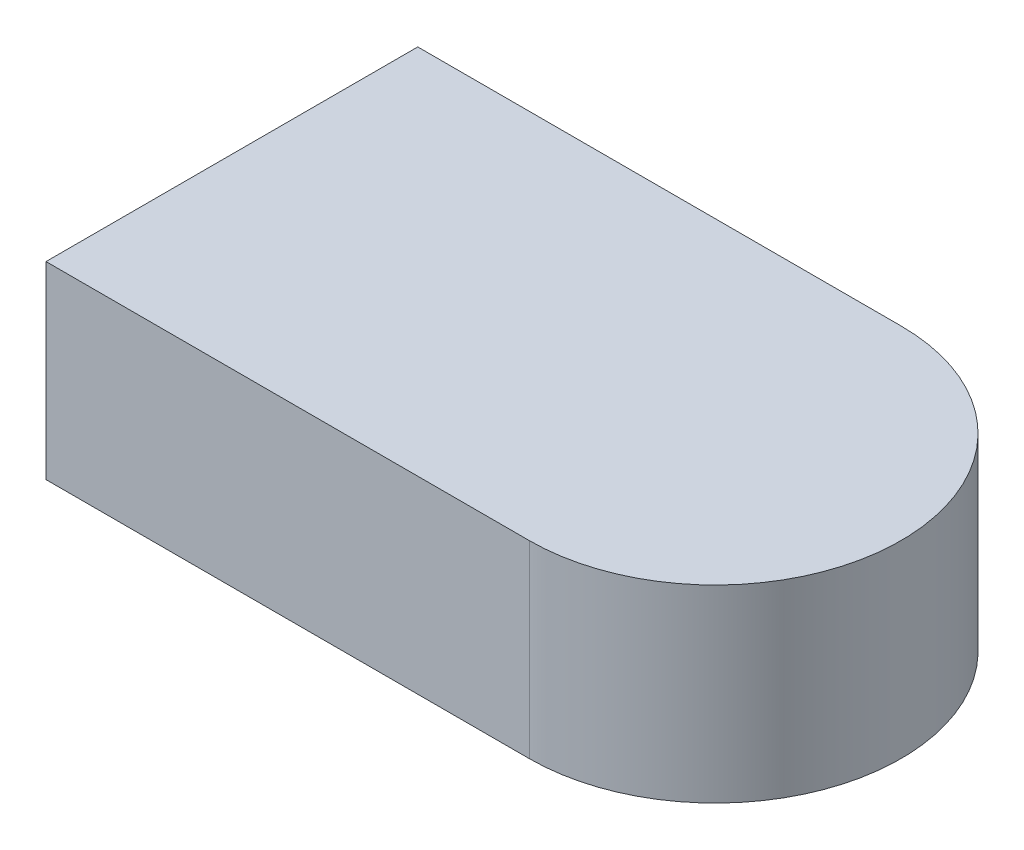
ISO-10303-21;
HEADER;
FILE_DESCRIPTION(('STEP AP214'),'2;1');
FILE_NAME('part.step','',(''),(''),'','','');
FILE_SCHEMA(('AUTOMOTIVE_DESIGN { 1 0 10303 214 1 1 1 1 }'));
ENDSEC;
DATA;
#1=APPLICATION_CONTEXT('core data for automotive mechanical design processes');
#2=APPLICATION_PROTOCOL_DEFINITION('international standard','automotive_design',2000,#1);
#3=PRODUCT_CONTEXT('',#1,'mechanical');
#4=PRODUCT('Part','Part','',(#3));
#5=PRODUCT_RELATED_PRODUCT_CATEGORY('part','',(#4));
#6=PRODUCT_DEFINITION_FORMATION('','',#4);
#7=PRODUCT_DEFINITION_CONTEXT('part definition',#1,'design');
#8=PRODUCT_DEFINITION('design','',#6,#7);
#9=PRODUCT_DEFINITION_SHAPE('','',#8);
#10=(LENGTH_UNIT() NAMED_UNIT(*) SI_UNIT(.MILLI.,.METRE.));
#11=(NAMED_UNIT(*) PLANE_ANGLE_UNIT() SI_UNIT($,.RADIAN.));
#12=(NAMED_UNIT(*) SI_UNIT($,.STERADIAN.) SOLID_ANGLE_UNIT());
#13=UNCERTAINTY_MEASURE_WITH_UNIT(LENGTH_MEASURE(1.E-05),#10,'distance_accuracy_value','');
#14=(GEOMETRIC_REPRESENTATION_CONTEXT(3) GLOBAL_UNCERTAINTY_ASSIGNED_CONTEXT((#13)) GLOBAL_UNIT_ASSIGNED_CONTEXT((#10,
#11,#12)) REPRESENTATION_CONTEXT('',''));
#15=CARTESIAN_POINT('',(0.,0.,0.));
#16=DIRECTION('',(0.,0.,1.));
#17=DIRECTION('',(1.,0.,0.));
#18=AXIS2_PLACEMENT_3D('',#15,#16,#17);
#19=CARTESIAN_POINT('',(-1.185,0.,-0.75));
#20=DIRECTION('',(0.,-1.,0.));
#21=DIRECTION('',(0.,0.,-1.));
#22=AXIS2_PLACEMENT_3D('',#19,#20,#21);
#23=PLANE('',#22);
#24=DIRECTION('',(-1.,0.,0.));
#25=VECTOR('',#24,1.);
#26=CARTESIAN_POINT('',(-1.185,0.,-0.625));
#27=LINE('',#26,#25);
#28=CARTESIAN_POINT('',(-1.185,0.,-0.625));
#29=VERTEX_POINT('',#28);
#30=CARTESIAN_POINT('',(-1.51,0.,-0.625));
#31=VERTEX_POINT('',#30);
#32=EDGE_CURVE('E56',#29,#31,#27,.T.);
#33=ORIENTED_EDGE('',*,*,#32,.T.);
#34=DIRECTION('',(0.,0.,-1.));
#35=VECTOR('',#34,1.);
#36=CARTESIAN_POINT('',(-1.51,0.,-0.875));
#37=LINE('',#36,#35);
#38=CARTESIAN_POINT('',(-1.51,0.,-0.875));
#39=VERTEX_POINT('',#38);
#40=EDGE_CURVE('E82',#31,#39,#37,.T.);
#41=ORIENTED_EDGE('',*,*,#40,.T.);
#42=DIRECTION('',(1.,0.,0.));
#43=VECTOR('',#42,1.);
#44=CARTESIAN_POINT('',(-1.51,0.,-0.875));
#45=LINE('',#44,#43);
#46=CARTESIAN_POINT('',(-1.185,0.,-0.875));
#47=VERTEX_POINT('',#46);
#48=EDGE_CURVE('E58',#39,#47,#45,.T.);
#49=ORIENTED_EDGE('',*,*,#48,.T.);
#50=CARTESIAN_POINT('',(-1.185,0.,-0.75));
#51=DIRECTION('',(0.,-1.,0.));
#52=DIRECTION('',(0.,0.,-1.));
#53=AXIS2_PLACEMENT_3D('',#50,#51,#52);
#54=CIRCLE('',#53,0.125);
#55=EDGE_CURVE('E20',#29,#47,#54,.F.);
#56=ORIENTED_EDGE('',*,*,#55,.F.);
#57=EDGE_LOOP('',(#33,#41,#49,#56));
#58=FACE_BOUND('',#57,.T.);
#59=ADVANCED_FACE('F17',(#58),#23,.T.);
#60=CARTESIAN_POINT('',(-1.185,0.127,-0.75));
#61=DIRECTION('',(0.,-1.,0.));
#62=DIRECTION('',(0.,0.,-1.));
#63=AXIS2_PLACEMENT_3D('',#60,#61,#62);
#64=CYLINDRICAL_SURFACE('',#63,0.125);
#65=CARTESIAN_POINT('',(-1.185,0.127,-0.75));
#66=DIRECTION('',(0.,-1.,0.));
#67=DIRECTION('',(0.,0.,-1.));
#68=AXIS2_PLACEMENT_3D('',#65,#66,#67);
#69=CIRCLE('',#68,0.125);
#70=CARTESIAN_POINT('',(-1.185,0.127,-0.875));
#71=VERTEX_POINT('',#70);
#72=CARTESIAN_POINT('',(-1.185,0.127,-0.625));
#73=VERTEX_POINT('',#72);
#74=EDGE_CURVE('E73',#71,#73,#69,.T.);
#75=ORIENTED_EDGE('',*,*,#74,.T.);
#76=DIRECTION('',(0.,1.,0.));
#77=VECTOR('',#76,1.);
#78=CARTESIAN_POINT('',(-1.185,0.127,-0.625));
#79=LINE('',#78,#77);
#80=EDGE_CURVE('E63',#73,#29,#79,.F.);
#81=ORIENTED_EDGE('',*,*,#80,.T.);
#82=ORIENTED_EDGE('',*,*,#55,.T.);
#83=DIRECTION('',(0.,1.,0.));
#84=VECTOR('',#83,1.);
#85=CARTESIAN_POINT('',(-1.185,0.127,-0.875));
#86=LINE('',#85,#84);
#87=EDGE_CURVE('E84',#47,#71,#86,.T.);
#88=ORIENTED_EDGE('',*,*,#87,.T.);
#89=EDGE_LOOP('',(#75,#81,#82,#88));
#90=FACE_BOUND('',#89,.T.);
#91=ADVANCED_FACE('F72',(#90),#64,.T.);
#92=CARTESIAN_POINT('',(-1.185,0.127,-0.625));
#93=DIRECTION('',(0.,0.,-1.));
#94=DIRECTION('',(-1.,0.,0.));
#95=AXIS2_PLACEMENT_3D('',#92,#93,#94);
#96=PLANE('',#95);
#97=ORIENTED_EDGE('',*,*,#80,.F.);
#98=DIRECTION('',(1.,0.,0.));
#99=VECTOR('',#98,1.);
#100=CARTESIAN_POINT('',(-1.185,0.127,-0.625));
#101=LINE('',#100,#99);
#102=CARTESIAN_POINT('',(-1.51,0.127,-0.625));
#103=VERTEX_POINT('',#102);
#104=EDGE_CURVE('E88',#73,#103,#101,.F.);
#105=ORIENTED_EDGE('',*,*,#104,.T.);
#106=DIRECTION('',(0.,1.,0.));
#107=VECTOR('',#106,1.);
#108=CARTESIAN_POINT('',(-1.51,0.127,-0.625));
#109=LINE('',#108,#107);
#110=EDGE_CURVE('E69',#103,#31,#109,.F.);
#111=ORIENTED_EDGE('',*,*,#110,.T.);
#112=ORIENTED_EDGE('',*,*,#32,.F.);
#113=EDGE_LOOP('',(#97,#105,#111,#112));
#114=FACE_BOUND('',#113,.T.);
#115=ADVANCED_FACE('F66',(#114),#96,.F.);
#116=CARTESIAN_POINT('',(-1.51,0.127,-0.875));
#117=DIRECTION('',(1.,0.,0.));
#118=DIRECTION('',(0.,0.,-1.));
#119=AXIS2_PLACEMENT_3D('',#116,#117,#118);
#120=PLANE('',#119);
#121=ORIENTED_EDGE('',*,*,#110,.F.);
#122=DIRECTION('',(0.,0.,-1.));
#123=VECTOR('',#122,1.);
#124=CARTESIAN_POINT('',(-1.51,0.127,-0.75));
#125=LINE('',#124,#123);
#126=CARTESIAN_POINT('',(-1.51,0.127,-0.875));
#127=VERTEX_POINT('',#126);
#128=EDGE_CURVE('E26',#103,#127,#125,.T.);
#129=ORIENTED_EDGE('',*,*,#128,.T.);
#130=DIRECTION('',(0.,1.,0.));
#131=VECTOR('',#130,1.);
#132=CARTESIAN_POINT('',(-1.51,0.127,-0.875));
#133=LINE('',#132,#131);
#134=EDGE_CURVE('E34',#127,#39,#133,.F.);
#135=ORIENTED_EDGE('',*,*,#134,.T.);
#136=ORIENTED_EDGE('',*,*,#40,.F.);
#137=EDGE_LOOP('',(#121,#129,#135,#136));
#138=FACE_BOUND('',#137,.T.);
#139=ADVANCED_FACE('F103',(#138),#120,.F.);
#140=CARTESIAN_POINT('',(-1.51,0.127,-0.875));
#141=DIRECTION('',(0.,0.,1.));
#142=DIRECTION('',(1.,0.,0.));
#143=AXIS2_PLACEMENT_3D('',#140,#141,#142);
#144=PLANE('',#143);
#145=ORIENTED_EDGE('',*,*,#134,.F.);
#146=DIRECTION('',(1.,0.,0.));
#147=VECTOR('',#146,1.);
#148=CARTESIAN_POINT('',(-1.185,0.127,-0.875));
#149=LINE('',#148,#147);
#150=EDGE_CURVE('E11',#127,#71,#149,.T.);
#151=ORIENTED_EDGE('',*,*,#150,.T.);
#152=ORIENTED_EDGE('',*,*,#87,.F.);
#153=ORIENTED_EDGE('',*,*,#48,.F.);
#154=EDGE_LOOP('',(#145,#151,#152,#153));
#155=FACE_BOUND('',#154,.T.);
#156=ADVANCED_FACE('F107',(#155),#144,.F.);
#157=CARTESIAN_POINT('',(-1.185,0.127,-0.75));
#158=DIRECTION('',(0.,-1.,0.));
#159=DIRECTION('',(0.,0.,-1.));
#160=AXIS2_PLACEMENT_3D('',#157,#158,#159);
#161=PLANE('',#160);
#162=ORIENTED_EDGE('',*,*,#128,.F.);
#163=ORIENTED_EDGE('',*,*,#104,.F.);
#164=ORIENTED_EDGE('',*,*,#74,.F.);
#165=ORIENTED_EDGE('',*,*,#150,.F.);
#166=EDGE_LOOP('',(#162,#163,#164,#165));
#167=FACE_BOUND('',#166,.T.);
#168=ADVANCED_FACE('F106',(#167),#161,.F.);
#169=CLOSED_SHELL('',(#59,#91,#115,#139,#156,#168));
#170=MANIFOLD_SOLID_BREP('B1',#169);
#171=ADVANCED_BREP_SHAPE_REPRESENTATION('',(#18,#170),#14);
#172=SHAPE_DEFINITION_REPRESENTATION(#9,#171);
ENDSEC;
END-ISO-10303-21;
